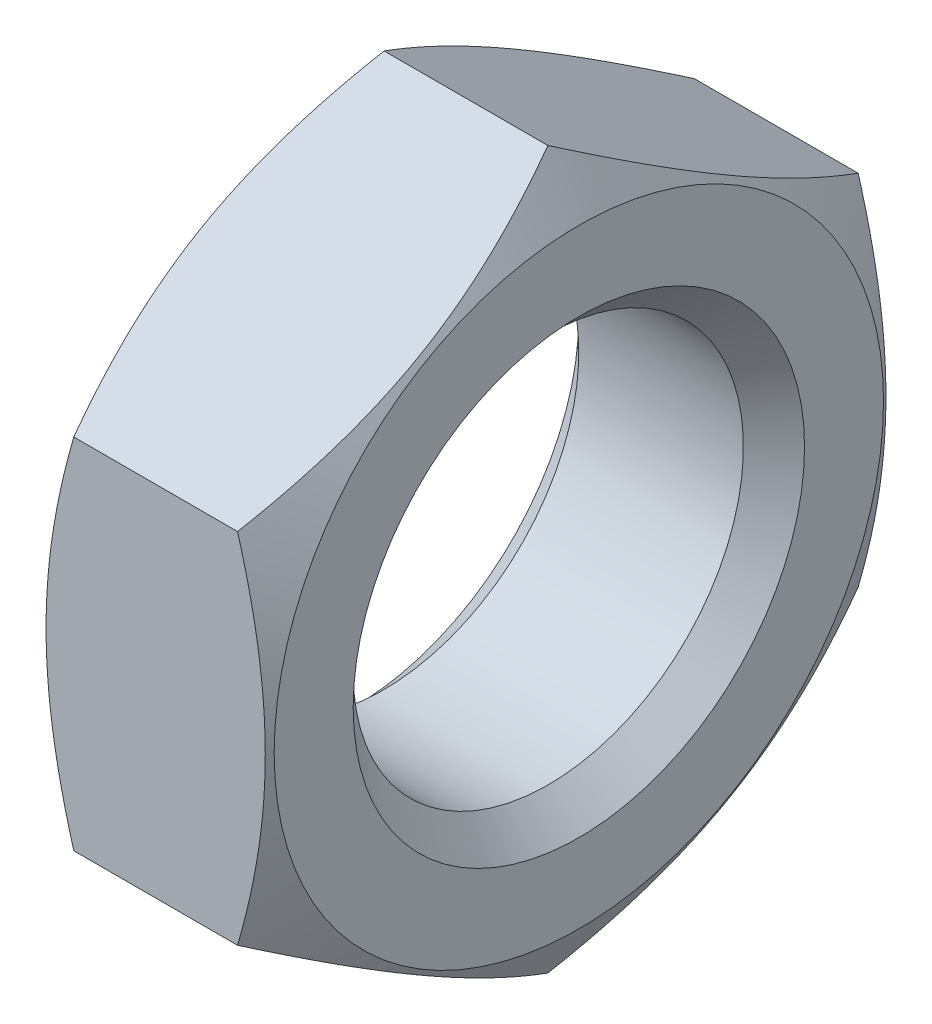
ISO-10303-21;
HEADER;
FILE_DESCRIPTION(('STEP AP214'),'2;1');
FILE_NAME('part.step','',(''),(''),'','','');
FILE_SCHEMA(('AUTOMOTIVE_DESIGN { 1 0 10303 214 1 1 1 1 }'));
ENDSEC;
DATA;
#1=APPLICATION_CONTEXT('core data for automotive mechanical design processes');
#2=APPLICATION_PROTOCOL_DEFINITION('international standard','automotive_design',2000,#1);
#3=PRODUCT_CONTEXT('',#1,'mechanical');
#4=PRODUCT('Part','Part','',(#3));
#5=PRODUCT_RELATED_PRODUCT_CATEGORY('part','',(#4));
#6=PRODUCT_DEFINITION_FORMATION('','',#4);
#7=PRODUCT_DEFINITION_CONTEXT('part definition',#1,'design');
#8=PRODUCT_DEFINITION('design','',#6,#7);
#9=PRODUCT_DEFINITION_SHAPE('','',#8);
#10=(LENGTH_UNIT() NAMED_UNIT(*) SI_UNIT(.MILLI.,.METRE.));
#11=(NAMED_UNIT(*) PLANE_ANGLE_UNIT() SI_UNIT($,.RADIAN.));
#12=(NAMED_UNIT(*) SI_UNIT($,.STERADIAN.) SOLID_ANGLE_UNIT());
#13=UNCERTAINTY_MEASURE_WITH_UNIT(LENGTH_MEASURE(1.E-05),#10,'distance_accuracy_value','');
#14=(GEOMETRIC_REPRESENTATION_CONTEXT(3) GLOBAL_UNCERTAINTY_ASSIGNED_CONTEXT((#13)) GLOBAL_UNIT_ASSIGNED_CONTEXT((#10,
#11,#12)) REPRESENTATION_CONTEXT('',''));
#15=CARTESIAN_POINT('',(0.,0.,0.));
#16=DIRECTION('',(0.,0.,1.));
#17=DIRECTION('',(1.,0.,0.));
#18=AXIS2_PLACEMENT_3D('',#15,#16,#17);
#19=CARTESIAN_POINT('',(2.,0.,0.));
#20=DIRECTION('',(1.,0.,0.));
#21=DIRECTION('',(0.,0.,-1.));
#22=AXIS2_PLACEMENT_3D('',#19,#20,#21);
#23=PLANE('',#22);
#24=CARTESIAN_POINT('',(2.,0.,0.));
#25=DIRECTION('',(-1.,0.,0.));
#26=DIRECTION('',(0.,0.,1.));
#27=AXIS2_PLACEMENT_3D('',#24,#25,#26);
#28=CIRCLE('',#27,4.);
#29=CARTESIAN_POINT('',(2.,0.,4.));
#30=VERTEX_POINT('',#29);
#31=EDGE_CURVE('E209',#30,#30,#28,.T.);
#32=ORIENTED_EDGE('',*,*,#31,.T.);
#33=EDGE_LOOP('',(#32));
#34=FACE_BOUND('',#33,.T.);
#35=CARTESIAN_POINT('',(2.,0.,0.));
#36=DIRECTION('',(-1.,0.,0.));
#37=DIRECTION('',(0.,0.,1.));
#38=AXIS2_PLACEMENT_3D('',#35,#36,#37);
#39=CIRCLE('',#38,5.4);
#40=CARTESIAN_POINT('',(2.,0.,5.4));
#41=VERTEX_POINT('',#40);
#42=EDGE_CURVE('E229',#41,#41,#39,.T.);
#43=ORIENTED_EDGE('',*,*,#42,.F.);
#44=EDGE_LOOP('',(#43));
#45=FACE_BOUND('',#44,.T.);
#46=ADVANCED_FACE('F37',(#34,#45),#23,.T.);
#47=CARTESIAN_POINT('',(-2.,0.,0.));
#48=DIRECTION('',(1.,0.,0.));
#49=DIRECTION('',(0.,0.,-1.));
#50=AXIS2_PLACEMENT_3D('',#47,#48,#49);
#51=PLANE('',#50);
#52=CARTESIAN_POINT('',(-2.,0.,0.));
#53=DIRECTION('',(-1.,0.,0.));
#54=DIRECTION('',(0.,0.,1.));
#55=AXIS2_PLACEMENT_3D('',#52,#53,#54);
#56=CIRCLE('',#55,4.);
#57=CARTESIAN_POINT('',(-2.,0.,4.));
#58=VERTEX_POINT('',#57);
#59=EDGE_CURVE('E114',#58,#58,#56,.T.);
#60=ORIENTED_EDGE('',*,*,#59,.F.);
#61=EDGE_LOOP('',(#60));
#62=FACE_BOUND('',#61,.T.);
#63=CARTESIAN_POINT('',(-2.,0.,0.));
#64=DIRECTION('',(-1.,0.,0.));
#65=DIRECTION('',(0.,0.,1.));
#66=AXIS2_PLACEMENT_3D('',#63,#64,#65);
#67=CIRCLE('',#66,5.4);
#68=CARTESIAN_POINT('',(-2.,0.,5.4));
#69=VERTEX_POINT('',#68);
#70=EDGE_CURVE('E97',#69,#69,#67,.T.);
#71=ORIENTED_EDGE('',*,*,#70,.T.);
#72=EDGE_LOOP('',(#71));
#73=FACE_BOUND('',#72,.T.);
#74=ADVANCED_FACE('F223',(#62,#73),#51,.F.);
#75=CARTESIAN_POINT('',(-1.4585,0.,0.));
#76=DIRECTION('',(-1.,0.,0.));
#77=DIRECTION('',(0.,0.,1.));
#78=AXIS2_PLACEMENT_3D('',#75,#76,#77);
#79=CONICAL_SURFACE('',#78,3.4585,0.785398163397448);
#80=ORIENTED_EDGE('',*,*,#59,.T.);
#81=EDGE_LOOP('',(#80));
#82=FACE_BOUND('',#81,.T.);
#83=CARTESIAN_POINT('',(-1.4585,0.,0.));
#84=DIRECTION('',(-1.,0.,0.));
#85=DIRECTION('',(0.,0.,1.));
#86=AXIS2_PLACEMENT_3D('',#83,#84,#85);
#87=CIRCLE('',#86,3.4585);
#88=CARTESIAN_POINT('',(-1.4585,0.,3.4585));
#89=VERTEX_POINT('',#88);
#90=EDGE_CURVE('E215',#89,#89,#87,.T.);
#91=ORIENTED_EDGE('',*,*,#90,.F.);
#92=EDGE_LOOP('',(#91));
#93=FACE_BOUND('',#92,.T.);
#94=ADVANCED_FACE('F220',(#82,#93),#79,.F.);
#95=CARTESIAN_POINT('',(2.,0.,0.));
#96=DIRECTION('',(-1.,0.,0.));
#97=DIRECTION('',(0.,0.,1.));
#98=AXIS2_PLACEMENT_3D('',#95,#96,#97);
#99=CYLINDRICAL_SURFACE('',#98,3.4585);
#100=ORIENTED_EDGE('',*,*,#90,.T.);
#101=EDGE_LOOP('',(#100));
#102=FACE_BOUND('',#101,.T.);
#103=CARTESIAN_POINT('',(1.4585,0.,0.));
#104=DIRECTION('',(-1.,0.,0.));
#105=DIRECTION('',(0.,0.,1.));
#106=AXIS2_PLACEMENT_3D('',#103,#104,#105);
#107=CIRCLE('',#106,3.4585);
#108=CARTESIAN_POINT('',(1.4585,0.,3.4585));
#109=VERTEX_POINT('',#108);
#110=EDGE_CURVE('E212',#109,#109,#107,.T.);
#111=ORIENTED_EDGE('',*,*,#110,.F.);
#112=EDGE_LOOP('',(#111));
#113=FACE_BOUND('',#112,.T.);
#114=ADVANCED_FACE('F287',(#102,#113),#99,.F.);
#115=CARTESIAN_POINT('',(2.,0.,0.));
#116=DIRECTION('',(1.,0.,0.));
#117=DIRECTION('',(0.,0.,-1.));
#118=AXIS2_PLACEMENT_3D('',#115,#116,#117);
#119=CONICAL_SURFACE('',#118,4.,0.785398163397448);
#120=ORIENTED_EDGE('',*,*,#110,.T.);
#121=EDGE_LOOP('',(#120));
#122=FACE_BOUND('',#121,.T.);
#123=ORIENTED_EDGE('',*,*,#31,.F.);
#124=EDGE_LOOP('',(#123));
#125=FACE_BOUND('',#124,.T.);
#126=ADVANCED_FACE('F157',(#122,#125),#119,.F.);
#127=CARTESIAN_POINT('',(-2.,0.,0.));
#128=DIRECTION('',(1.,0.,0.));
#129=DIRECTION('',(0.,0.,-1.));
#130=AXIS2_PLACEMENT_3D('',#127,#128,#129);
#131=CONICAL_SURFACE('',#130,5.4,1.0471975511966);
#132=ORIENTED_EDGE('',*,*,#70,.F.);
#133=EDGE_LOOP('',(#132));
#134=FACE_BOUND('',#133,.T.);
#135=CARTESIAN_POINT('',(0.784113443749843,-8.61649018684511,5.5));
#136=CARTESIAN_POINT('',(0.666878812783997,-8.37552882727682,5.5));
#137=CARTESIAN_POINT('',(0.550743390874346,-8.13402357629088,5.5));
#138=CARTESIAN_POINT('',(0.321287470280928,-7.64963639126843,5.5));
#139=CARTESIAN_POINT('',(0.207967398695277,-7.40675425513533,5.5));
#140=CARTESIAN_POINT('',(-0.0157929884205948,-6.91811415046306,5.5));
#141=CARTESIAN_POINT('',(-0.126215004170548,-6.67234777367908,5.5));
#142=CARTESIAN_POINT('',(-0.342654969596933,-6.17889047949948,5.5));
#143=CARTESIAN_POINT('',(-0.448673121640389,-5.93119965115882,5.5));
#144=CARTESIAN_POINT('',(-0.658600467087506,-5.42517186891712,5.5));
#145=CARTESIAN_POINT('',(-0.762320422184984,-5.16675598886647,5.5));
#146=CARTESIAN_POINT('',(-0.962118747037396,-4.6469329169376,5.5));
#147=CARTESIAN_POINT('',(-1.05819627140808,-4.38552539778091,5.5));
#148=CARTESIAN_POINT('',(-1.24025124215414,-3.85976601496737,5.5));
#149=CARTESIAN_POINT('',(-1.3262484073163,-3.59542104580034,5.5));
#150=CARTESIAN_POINT('',(-1.48543975232521,-3.06293694594078,5.5));
#151=CARTESIAN_POINT('',(-1.55863787395657,-2.79479901098241,5.5));
#152=CARTESIAN_POINT('',(-1.6883840040391,-2.25609913996338,5.5));
#153=CARTESIAN_POINT('',(-1.74502563454898,-1.9855601132483,5.5));
#154=CARTESIAN_POINT('',(-1.83850933501161,-1.44098961438313,5.5));
#155=CARTESIAN_POINT('',(-1.87535342543688,-1.16695850154727,5.5));
#156=CARTESIAN_POINT('',(-1.91332936173482,-0.756204569653661,5.5));
#157=CARTESIAN_POINT('',(-1.92309725948238,-0.620247319437219,5.5));
#158=CARTESIAN_POINT('',(-1.9368747665775,-0.348045878571672,5.5));
#159=CARTESIAN_POINT('',(-1.94088491768322,-0.211801716126978,5.5));
#160=CARTESIAN_POINT('',(-1.94304622483372,0.06074358164608,5.5));
#161=CARTESIAN_POINT('',(-1.94119691038516,0.197044720670794,5.5));
#162=CARTESIAN_POINT('',(-1.93168662957024,0.469434533184992,5.5));
#163=CARTESIAN_POINT('',(-1.92402588138275,0.605523214458589,5.5));
#164=CARTESIAN_POINT('',(-1.89899644697809,0.929994242672534,5.5));
#165=CARTESIAN_POINT('',(-1.87901437870704,1.11817945565695,5.5));
#166=CARTESIAN_POINT('',(-1.82900797286511,1.49320092322069,5.5));
#167=CARTESIAN_POINT('',(-1.79898234204711,1.68003700091358,5.5));
#168=CARTESIAN_POINT('',(-1.69542809214979,2.23828118446945,5.5));
#169=CARTESIAN_POINT('',(-1.60843937722605,2.60722815877613,5.5));
#170=CARTESIAN_POINT('',(-1.45698147742335,3.15902046903996,5.5));
#171=CARTESIAN_POINT('',(-1.40227782374634,3.34471145261655,5.5));
#172=CARTESIAN_POINT('',(-1.28703497257315,3.714291476791,5.5));
#173=CARTESIAN_POINT('',(-1.22649573471635,3.89818050491632,5.5));
#174=CARTESIAN_POINT('',(-1.10056574792467,4.26421150500201,5.5));
#175=CARTESIAN_POINT('',(-1.03517648373062,4.446353992507,5.5));
#176=CARTESIAN_POINT('',(-0.90033110397769,4.80911957514401,5.5));
#177=CARTESIAN_POINT('',(-0.830875048241357,4.9897426925813,5.5));
#178=CARTESIAN_POINT('',(-0.655718433206676,5.432716506941,5.5));
#179=CARTESIAN_POINT('',(-0.548087902925681,5.69430288472036,5.5));
#180=CARTESIAN_POINT('',(-0.327205022834359,6.21509900538682,5.5));
#181=CARTESIAN_POINT('',(-0.213952250737957,6.47430856801397,5.5));
#182=CARTESIAN_POINT('',(0.0169882335780446,6.99081532432005,5.5));
#183=CARTESIAN_POINT('',(0.134677031739859,7.24811203103113,5.5));
#184=CARTESIAN_POINT('',(0.373555198105092,7.76107844152761,5.5));
#185=CARTESIAN_POINT('',(0.494744652441861,8.01674810509055,5.5));
#186=CARTESIAN_POINT('',(0.740083399738742,8.52704887122562,5.5));
#187=CARTESIAN_POINT('',(0.864236156536966,8.78167830543824,5.5));
#188=CARTESIAN_POINT('',(1.11483419370451,9.28980766382626,5.5));
#189=CARTESIAN_POINT('',(1.24127949642127,9.5433075769612,5.5));
#190=CARTESIAN_POINT('',(1.62337644927655,10.3023145200846,5.5));
#191=CARTESIAN_POINT('',(1.88182910949109,10.8064111488454,5.5));
#192=CARTESIAN_POINT('',(2.3803301306435,11.7665070805488,5.5));
#193=CARTESIAN_POINT('',(2.61993279563596,12.222738882869,5.5));
#194=CARTESIAN_POINT('',(3.10234058749318,13.1335302206051,5.5));
#195=CARTESIAN_POINT('',(3.34514585172205,13.5880896832154,5.5));
#196=CARTESIAN_POINT('',(3.83248871005734,14.4946368928826,5.5));
#197=CARTESIAN_POINT('',(4.07701954950786,14.9466282770015,5.5));
#198=CARTESIAN_POINT('',(4.56796368692335,15.8495513113053,5.5));
#199=CARTESIAN_POINT('',(4.81437686600827,16.3004830261002,5.5));
#200=CARTESIAN_POINT('',(5.06148675954346,16.751030036576,5.5));
#201=B_SPLINE_CURVE_WITH_KNOTS('',3,(#135,#136,#137,#138,#139,#140,#141,#142,#143,#144,#145,
#146,#147,#148,#149,#150,#151,#152,#153,#154,#155,#156,#157,#158,#159,#160,#161,#162,#163,#164,
#165,#166,#167,#168,#169,#170,#171,#172,#173,#174,#175,#176,#177,#178,#179,#180,#181,#182,#183,
#184,#185,#186,#187,#188,#189,#190,#191,#192,#193,#194,#195,#196,#197,#198,#199,#200),
.UNSPECIFIED.,.F.,.F.,(4,2,2,2,2,2,2,2,2,2,2,2,2,2,2,2,2,2,2,2,2,2,2,2,2,2,2,2,2,2,2,2,4),(0.,
0.80391053793647,1.6079422961888,2.41620661179091,3.22443374472603,4.05970219374216,
4.89506290969333,5.72876124852091,6.56220237518367,7.39083518546822,8.21938341211543,
8.62820309904799,9.03698431677828,9.44579835895563,9.85459705377212,10.4220076622402,
10.9894913607876,12.125049587267,12.7057420601234,13.2864385495102,13.8669579979469,
14.4474689090817,15.2959680877209,16.1445310937663,16.9933031952078,17.8420961984341,
18.6919353169031,19.5417827239507,21.2412028410503,22.7871558297497,24.3331753436265,
25.874865733381,27.4164595489447),.UNSPECIFIED.);
#202=CARTESIAN_POINT('',(-1.45102478695733,-3.1754264805429,5.5));
#203=VERTEX_POINT('',#202);
#204=CARTESIAN_POINT('',(-1.45102478695733,3.1754264805429,5.5));
#205=VERTEX_POINT('',#204);
#206=EDGE_CURVE('E53',#203,#205,#201,.T.);
#207=ORIENTED_EDGE('',*,*,#206,.T.);
#208=CARTESIAN_POINT('',(-1.45095811847252,3.17531101048906,5.5002));
#209=CARTESIAN_POINT('',(-1.49125139790122,3.24511067806418,5.37930342940848));
#210=CARTESIAN_POINT('',(-1.52971605921933,3.3151705928067,5.25795609750049));
#211=CARTESIAN_POINT('',(-1.60248450149056,3.45585938651129,5.01427595874856));
#212=CARTESIAN_POINT('',(-1.63678648749366,3.52648849701128,4.89194275086919));
#213=CARTESIAN_POINT('',(-1.7327751540074,3.73950670736877,4.52298438759264));
#214=CARTESIAN_POINT('',(-1.78737266542132,3.88273666897656,4.2749028169218));
#215=CARTESIAN_POINT('',(-1.85139513517346,4.09707770471201,3.90365325288108));
#216=CARTESIAN_POINT('',(-1.86963337340979,4.16754833602165,3.78159453901133));
#217=CARTESIAN_POINT('',(-1.90021645806482,4.30880802924418,3.53692557328832));
#218=CARTESIAN_POINT('',(-1.91256182519871,4.37959706246375,3.41431537113335));
#219=CARTESIAN_POINT('',(-1.93104454206384,4.52129808426999,3.16888200188052));
#220=CARTESIAN_POINT('',(-1.93718893737989,4.59220984140338,3.0460592356715));
#221=CARTESIAN_POINT('',(-1.94314454882016,4.7340949578992,2.80030700506291));
#222=CARTESIAN_POINT('',(-1.94295596057464,4.80506831529103,2.67737754407652));
#223=CARTESIAN_POINT('',(-1.93373406113082,4.99951505180813,2.34058591706296));
#224=CARTESIAN_POINT('',(-1.9182510049378,5.12292478867203,2.12683398266599));
#225=CARTESIAN_POINT('',(-1.86915286895632,5.36892457999607,1.7007498454414));
#226=CARTESIAN_POINT('',(-1.83552100569145,5.49151376923311,1.48841914122418));
#227=CARTESIAN_POINT('',(-1.75145062288955,5.73800868579223,1.06147742193635));
#228=CARTESIAN_POINT('',(-1.70065588529232,5.86188330811686,0.84692028230169));
#229=CARTESIAN_POINT('',(-1.58537213921055,6.10778517066234,0.421005762697096));
#230=CARTESIAN_POINT('',(-1.52091021259377,6.22981556037921,0.209642927640055));
#231=CARTESIAN_POINT('',(-1.4509581184725,6.35096843113974,-0.000199999999999625));
#232=B_SPLINE_CURVE_WITH_KNOTS('',3,(#208,#209,#210,#211,#212,#213,#214,#215,#216,#217,#218,
#219,#220,#221,#222,#223,#224,#225,#226,#227,#228,#229,#230,#231),.UNSPECIFIED.,.F.,.F.,(4,2,2,
2,2,2,2,2,2,2,2,4),(0.,0.435859336764065,0.871905953714896,1.74581116421112,2.17206086600113,
2.59827289586658,3.02400011377214,3.44971418068092,4.19085033838045,4.93267305422207,
5.69094899585909,6.44773620806184),.UNSPECIFIED.);
#233=CARTESIAN_POINT('',(-1.45102478695731,6.3508529610859,0.));
#234=VERTEX_POINT('',#233);
#235=EDGE_CURVE('E88',#205,#234,#232,.T.);
#236=ORIENTED_EDGE('',*,*,#235,.T.);
#237=CARTESIAN_POINT('',(-1.4509581184725,6.35096843113974,0.0002));
#238=CARTESIAN_POINT('',(-1.4912513979012,6.28116876356462,-0.120696570591515));
#239=CARTESIAN_POINT('',(-1.52971605921931,6.2111088488221,-0.242043902499506));
#240=CARTESIAN_POINT('',(-1.60248450149054,6.0704200551175,-0.485724041251439));
#241=CARTESIAN_POINT('',(-1.63678648749364,5.99979094461752,-0.60805724913081));
#242=CARTESIAN_POINT('',(-1.73277515400738,5.78677273426003,-0.977015612407364));
#243=CARTESIAN_POINT('',(-1.7873726654213,5.64354277265223,-1.2250971830782));
#244=CARTESIAN_POINT('',(-1.85139513517345,5.42920173691679,-1.59634674711893));
#245=CARTESIAN_POINT('',(-1.86963337340978,5.35873110560715,-1.71840546098868));
#246=CARTESIAN_POINT('',(-1.90021645806482,5.21747141238461,-1.96307442671169));
#247=CARTESIAN_POINT('',(-1.9125618251987,5.14668237916505,-2.08568462886666));
#248=CARTESIAN_POINT('',(-1.93104454206384,5.0049813573588,-2.3311179981195));
#249=CARTESIAN_POINT('',(-1.93718893737989,4.93406960022541,-2.45394076432851));
#250=CARTESIAN_POINT('',(-1.94314454882016,4.79218448372959,-2.6996929949371));
#251=CARTESIAN_POINT('',(-1.94295596057464,4.72121112633776,-2.82262245592349));
#252=CARTESIAN_POINT('',(-1.93373406113082,4.52676438982067,-3.15941408293705));
#253=CARTESIAN_POINT('',(-1.91825100493781,4.40335465295677,-3.37316601733403));
#254=CARTESIAN_POINT('',(-1.86915286895633,4.15735486163272,-3.79925015455861));
#255=CARTESIAN_POINT('',(-1.83552100569146,4.03476567239569,-4.01158085877582));
#256=CARTESIAN_POINT('',(-1.75145062288956,3.78827075583657,-4.43852257806365));
#257=CARTESIAN_POINT('',(-1.70065588529233,3.66439613351194,-4.65307971769831));
#258=CARTESIAN_POINT('',(-1.58537213921056,3.41849427096646,-5.07899423730291));
#259=CARTESIAN_POINT('',(-1.52091021259379,3.29646388124959,-5.29035707235995));
#260=CARTESIAN_POINT('',(-1.45095811847252,3.17531101048906,-5.5002));
#261=B_SPLINE_CURVE_WITH_KNOTS('',3,(#237,#238,#239,#240,#241,#242,#243,#244,#245,#246,#247,
#248,#249,#250,#251,#252,#253,#254,#255,#256,#257,#258,#259,#260),.UNSPECIFIED.,.F.,.F.,(4,2,2,
2,2,2,2,2,2,2,2,4),(0.,0.435859336764067,0.8719059537149,1.74581116421113,2.17206086600114,
2.59827289586659,3.02400011377216,3.44971418068095,4.19085033838047,4.93267305422208,
5.6909489958591,6.44773620806184),.UNSPECIFIED.);
#262=CARTESIAN_POINT('',(-1.45102478695733,3.1754264805429,-5.5));
#263=VERTEX_POINT('',#262);
#264=EDGE_CURVE('E91',#234,#263,#261,.T.);
#265=ORIENTED_EDGE('',*,*,#264,.T.);
#266=CARTESIAN_POINT('',(0.784113443749843,-8.61649018684511,-5.5));
#267=CARTESIAN_POINT('',(0.666878812783997,-8.37552882727682,-5.5));
#268=CARTESIAN_POINT('',(0.550743390874346,-8.13402357629088,-5.5));
#269=CARTESIAN_POINT('',(0.321287470280928,-7.64963639126843,-5.5));
#270=CARTESIAN_POINT('',(0.207967398695277,-7.40675425513533,-5.5));
#271=CARTESIAN_POINT('',(-0.0157929884205948,-6.91811415046306,-5.5));
#272=CARTESIAN_POINT('',(-0.126215004170548,-6.67234777367908,-5.5));
#273=CARTESIAN_POINT('',(-0.342654969596933,-6.17889047949948,-5.5));
#274=CARTESIAN_POINT('',(-0.448673121640389,-5.93119965115882,-5.5));
#275=CARTESIAN_POINT('',(-0.658600467087506,-5.42517186891712,-5.5));
#276=CARTESIAN_POINT('',(-0.762320422184984,-5.16675598886647,-5.5));
#277=CARTESIAN_POINT('',(-0.962118747037396,-4.6469329169376,-5.5));
#278=CARTESIAN_POINT('',(-1.05819627140808,-4.38552539778091,-5.5));
#279=CARTESIAN_POINT('',(-1.24025124215414,-3.85976601496737,-5.5));
#280=CARTESIAN_POINT('',(-1.3262484073163,-3.59542104580034,-5.5));
#281=CARTESIAN_POINT('',(-1.48543975232521,-3.06293694594078,-5.5));
#282=CARTESIAN_POINT('',(-1.55863787395657,-2.79479901098241,-5.5));
#283=CARTESIAN_POINT('',(-1.6883840040391,-2.25609913996338,-5.5));
#284=CARTESIAN_POINT('',(-1.74502563454898,-1.9855601132483,-5.5));
#285=CARTESIAN_POINT('',(-1.83850933501161,-1.44098961438313,-5.5));
#286=CARTESIAN_POINT('',(-1.87535342543688,-1.16695850154727,-5.5));
#287=CARTESIAN_POINT('',(-1.91332936173482,-0.756204569653661,-5.5));
#288=CARTESIAN_POINT('',(-1.92309725948238,-0.620247319437219,-5.5));
#289=CARTESIAN_POINT('',(-1.9368747665775,-0.348045878571672,-5.5));
#290=CARTESIAN_POINT('',(-1.94088491768322,-0.211801716126978,-5.5));
#291=CARTESIAN_POINT('',(-1.94304622483372,0.06074358164608,-5.5));
#292=CARTESIAN_POINT('',(-1.94119691038516,0.197044720670794,-5.5));
#293=CARTESIAN_POINT('',(-1.93168662957024,0.469434533184992,-5.5));
#294=CARTESIAN_POINT('',(-1.92402588138275,0.605523214458589,-5.5));
#295=CARTESIAN_POINT('',(-1.89899644697809,0.929994242672534,-5.5));
#296=CARTESIAN_POINT('',(-1.87901437870704,1.11817945565695,-5.5));
#297=CARTESIAN_POINT('',(-1.82900797286511,1.49320092322069,-5.5));
#298=CARTESIAN_POINT('',(-1.79898234204711,1.68003700091358,-5.5));
#299=CARTESIAN_POINT('',(-1.69542809214979,2.23828118446945,-5.5));
#300=CARTESIAN_POINT('',(-1.60843937722605,2.60722815877613,-5.5));
#301=CARTESIAN_POINT('',(-1.45698147742335,3.15902046903996,-5.5));
#302=CARTESIAN_POINT('',(-1.40227782374634,3.34471145261655,-5.5));
#303=CARTESIAN_POINT('',(-1.28703497257315,3.714291476791,-5.5));
#304=CARTESIAN_POINT('',(-1.22649573471635,3.89818050491632,-5.5));
#305=CARTESIAN_POINT('',(-1.10056574792467,4.26421150500201,-5.5));
#306=CARTESIAN_POINT('',(-1.03517648373062,4.446353992507,-5.5));
#307=CARTESIAN_POINT('',(-0.90033110397769,4.80911957514401,-5.5));
#308=CARTESIAN_POINT('',(-0.830875048241357,4.9897426925813,-5.5));
#309=CARTESIAN_POINT('',(-0.655718433206676,5.432716506941,-5.5));
#310=CARTESIAN_POINT('',(-0.548087902925681,5.69430288472036,-5.5));
#311=CARTESIAN_POINT('',(-0.327205022834359,6.21509900538682,-5.5));
#312=CARTESIAN_POINT('',(-0.213952250737957,6.47430856801397,-5.5));
#313=CARTESIAN_POINT('',(0.0169882335780446,6.99081532432005,-5.5));
#314=CARTESIAN_POINT('',(0.134677031739859,7.24811203103113,-5.5));
#315=CARTESIAN_POINT('',(0.373555198105092,7.76107844152761,-5.5));
#316=CARTESIAN_POINT('',(0.494744652441861,8.01674810509055,-5.5));
#317=CARTESIAN_POINT('',(0.740083399738742,8.52704887122562,-5.5));
#318=CARTESIAN_POINT('',(0.864236156536966,8.78167830543824,-5.5));
#319=CARTESIAN_POINT('',(1.11483419370451,9.28980766382626,-5.5));
#320=CARTESIAN_POINT('',(1.24127949642127,9.5433075769612,-5.5));
#321=CARTESIAN_POINT('',(1.62337644927655,10.3023145200846,-5.5));
#322=CARTESIAN_POINT('',(1.88182910949109,10.8064111488454,-5.5));
#323=CARTESIAN_POINT('',(2.3803301306435,11.7665070805488,-5.5));
#324=CARTESIAN_POINT('',(2.61993279563596,12.222738882869,-5.5));
#325=CARTESIAN_POINT('',(3.10234058749318,13.1335302206051,-5.5));
#326=CARTESIAN_POINT('',(3.34514585172205,13.5880896832154,-5.5));
#327=CARTESIAN_POINT('',(3.83248871005734,14.4946368928826,-5.5));
#328=CARTESIAN_POINT('',(4.07701954950786,14.9466282770015,-5.5));
#329=CARTESIAN_POINT('',(4.56796368692335,15.8495513113053,-5.5));
#330=CARTESIAN_POINT('',(4.81437686600827,16.3004830261002,-5.5));
#331=CARTESIAN_POINT('',(5.06148675954346,16.751030036576,-5.5));
#332=B_SPLINE_CURVE_WITH_KNOTS('',3,(#266,#267,#268,#269,#270,#271,#272,#273,#274,#275,#276,
#277,#278,#279,#280,#281,#282,#283,#284,#285,#286,#287,#288,#289,#290,#291,#292,#293,#294,#295,
#296,#297,#298,#299,#300,#301,#302,#303,#304,#305,#306,#307,#308,#309,#310,#311,#312,#313,#314,
#315,#316,#317,#318,#319,#320,#321,#322,#323,#324,#325,#326,#327,#328,#329,#330,#331),
.UNSPECIFIED.,.F.,.F.,(4,2,2,2,2,2,2,2,2,2,2,2,2,2,2,2,2,2,2,2,2,2,2,2,2,2,2,2,2,2,2,2,4),(0.,
0.80391053793647,1.6079422961888,2.41620661179091,3.22443374472603,4.05970219374216,
4.89506290969333,5.72876124852091,6.56220237518367,7.39083518546822,8.21938341211543,
8.62820309904799,9.03698431677828,9.44579835895563,9.85459705377212,10.4220076622402,
10.9894913607876,12.125049587267,12.7057420601234,13.2864385495102,13.8669579979469,
14.4474689090817,15.2959680877209,16.1445310937663,16.9933031952078,17.8420961984341,
18.6919353169031,19.5417827239507,21.2412028410503,22.7871558297497,24.3331753436265,
25.874865733381,27.4164595489447),.UNSPECIFIED.);
#333=CARTESIAN_POINT('',(-1.45102478695759,-3.17542648054329,-5.5));
#334=VERTEX_POINT('',#333);
#335=EDGE_CURVE('E106',#263,#334,#332,.F.);
#336=ORIENTED_EDGE('',*,*,#335,.T.);
#337=CARTESIAN_POINT('',(-1.45095811847252,-3.17531101048906,-5.5002));
#338=CARTESIAN_POINT('',(-1.49125139790122,-3.24511067806418,-5.37930342940848));
#339=CARTESIAN_POINT('',(-1.52971605921933,-3.3151705928067,-5.25795609750049));
#340=CARTESIAN_POINT('',(-1.60248450149056,-3.45585938651129,-5.01427595874856));
#341=CARTESIAN_POINT('',(-1.63678648749366,-3.52648849701128,-4.89194275086919));
#342=CARTESIAN_POINT('',(-1.7327751540074,-3.73950670736877,-4.52298438759264));
#343=CARTESIAN_POINT('',(-1.78737266542132,-3.88273666897656,-4.2749028169218));
#344=CARTESIAN_POINT('',(-1.85139513517346,-4.09707770471201,-3.90365325288108));
#345=CARTESIAN_POINT('',(-1.86963337340979,-4.16754833602165,-3.78159453901133));
#346=CARTESIAN_POINT('',(-1.90021645806482,-4.30880802924418,-3.53692557328832));
#347=CARTESIAN_POINT('',(-1.91256182519871,-4.37959706246375,-3.41431537113335));
#348=CARTESIAN_POINT('',(-1.93104454206384,-4.52129808426999,-3.16888200188052));
#349=CARTESIAN_POINT('',(-1.93718893737989,-4.59220984140338,-3.0460592356715));
#350=CARTESIAN_POINT('',(-1.94314454882016,-4.7340949578992,-2.80030700506291));
#351=CARTESIAN_POINT('',(-1.94295596057464,-4.80506831529103,-2.67737754407652));
#352=CARTESIAN_POINT('',(-1.93373406113082,-4.99951505180813,-2.34058591706296));
#353=CARTESIAN_POINT('',(-1.9182510049378,-5.12292478867203,-2.12683398266599));
#354=CARTESIAN_POINT('',(-1.86915286895632,-5.36892457999607,-1.7007498454414));
#355=CARTESIAN_POINT('',(-1.83552100569145,-5.49151376923311,-1.48841914122418));
#356=CARTESIAN_POINT('',(-1.75145062288955,-5.73800868579223,-1.06147742193635));
#357=CARTESIAN_POINT('',(-1.70065588529232,-5.86188330811686,-0.84692028230169));
#358=CARTESIAN_POINT('',(-1.58537213921055,-6.10778517066234,-0.421005762697096));
#359=CARTESIAN_POINT('',(-1.52091021259377,-6.22981556037921,-0.209642927640055));
#360=CARTESIAN_POINT('',(-1.4509581184725,-6.35096843113974,0.000199999999999625));
#361=B_SPLINE_CURVE_WITH_KNOTS('',3,(#337,#338,#339,#340,#341,#342,#343,#344,#345,#346,#347,
#348,#349,#350,#351,#352,#353,#354,#355,#356,#357,#358,#359,#360),.UNSPECIFIED.,.F.,.F.,(4,2,2,
2,2,2,2,2,2,2,2,4),(0.,0.435859336764065,0.871905953714896,1.74581116421112,2.17206086600113,
2.59827289586658,3.02400011377214,3.44971418068092,4.19085033838045,4.93267305422207,
5.69094899585909,6.44773620806184),.UNSPECIFIED.);
#362=CARTESIAN_POINT('',(-1.45102478695731,-6.3508529610859,0.));
#363=VERTEX_POINT('',#362);
#364=EDGE_CURVE('E126',#334,#363,#361,.T.);
#365=ORIENTED_EDGE('',*,*,#364,.T.);
#366=CARTESIAN_POINT('',(-1.4509581184725,-6.35096843113974,-0.0002));
#367=CARTESIAN_POINT('',(-1.4912513979012,-6.28116876356462,0.120696570591515));
#368=CARTESIAN_POINT('',(-1.52971605921931,-6.2111088488221,0.242043902499506));
#369=CARTESIAN_POINT('',(-1.60248450149054,-6.0704200551175,0.485724041251439));
#370=CARTESIAN_POINT('',(-1.63678648749364,-5.99979094461752,0.60805724913081));
#371=CARTESIAN_POINT('',(-1.73277515400738,-5.78677273426003,0.977015612407364));
#372=CARTESIAN_POINT('',(-1.7873726654213,-5.64354277265223,1.2250971830782));
#373=CARTESIAN_POINT('',(-1.85139513517345,-5.42920173691679,1.59634674711893));
#374=CARTESIAN_POINT('',(-1.86963337340978,-5.35873110560715,1.71840546098868));
#375=CARTESIAN_POINT('',(-1.90021645806482,-5.21747141238461,1.96307442671169));
#376=CARTESIAN_POINT('',(-1.9125618251987,-5.14668237916505,2.08568462886666));
#377=CARTESIAN_POINT('',(-1.93104454206384,-5.0049813573588,2.3311179981195));
#378=CARTESIAN_POINT('',(-1.93718893737989,-4.93406960022541,2.45394076432851));
#379=CARTESIAN_POINT('',(-1.94314454882016,-4.79218448372959,2.6996929949371));
#380=CARTESIAN_POINT('',(-1.94295596057464,-4.72121112633776,2.82262245592349));
#381=CARTESIAN_POINT('',(-1.93373406113082,-4.52676438982067,3.15941408293705));
#382=CARTESIAN_POINT('',(-1.91825100493781,-4.40335465295677,3.37316601733403));
#383=CARTESIAN_POINT('',(-1.86915286895633,-4.15735486163272,3.79925015455861));
#384=CARTESIAN_POINT('',(-1.83552100569146,-4.03476567239569,4.01158085877582));
#385=CARTESIAN_POINT('',(-1.75145062288956,-3.78827075583657,4.43852257806365));
#386=CARTESIAN_POINT('',(-1.70065588529233,-3.66439613351194,4.65307971769831));
#387=CARTESIAN_POINT('',(-1.58537213921056,-3.41849427096646,5.07899423730291));
#388=CARTESIAN_POINT('',(-1.52091021259379,-3.29646388124959,5.29035707235995));
#389=CARTESIAN_POINT('',(-1.45095811847252,-3.17531101048906,5.5002));
#390=B_SPLINE_CURVE_WITH_KNOTS('',3,(#366,#367,#368,#369,#370,#371,#372,#373,#374,#375,#376,
#377,#378,#379,#380,#381,#382,#383,#384,#385,#386,#387,#388,#389),.UNSPECIFIED.,.F.,.F.,(4,2,2,
2,2,2,2,2,2,2,2,4),(0.,0.435859336764067,0.8719059537149,1.74581116421113,2.17206086600114,
2.59827289586659,3.02400011377216,3.44971418068095,4.19085033838047,4.93267305422208,
5.6909489958591,6.44773620806184),.UNSPECIFIED.);
#391=EDGE_CURVE('E134',#363,#203,#390,.T.);
#392=ORIENTED_EDGE('',*,*,#391,.T.);
#393=EDGE_LOOP('',(#207,#236,#265,#336,#365,#392));
#394=FACE_BOUND('',#393,.T.);
#395=ADVANCED_FACE('F90',(#134,#394),#131,.T.);
#396=CARTESIAN_POINT('',(0.,0.,0.));
#397=DIRECTION('',(-1.,0.,0.));
#398=DIRECTION('',(0.,0.,1.));
#399=AXIS2_PLACEMENT_3D('',#396,#397,#398);
#400=CONICAL_SURFACE('',#399,8.8641016151378,1.0471975511966);
#401=ORIENTED_EDGE('',*,*,#42,.T.);
#402=EDGE_LOOP('',(#401));
#403=FACE_BOUND('',#402,.T.);
#404=CARTESIAN_POINT('',(-0.784113443749844,-8.61649018684511,5.5));
#405=CARTESIAN_POINT('',(-0.666878812783998,-8.37552882727682,5.5));
#406=CARTESIAN_POINT('',(-0.550743390874347,-8.13402357629088,5.5));
#407=CARTESIAN_POINT('',(-0.321287470280928,-7.64963639126843,5.5));
#408=CARTESIAN_POINT('',(-0.207967398695277,-7.40675425513533,5.5));
#409=CARTESIAN_POINT('',(0.0157929884205948,-6.91811415046306,5.5));
#410=CARTESIAN_POINT('',(0.126215004170548,-6.67234777367908,5.5));
#411=CARTESIAN_POINT('',(0.342654969596934,-6.17889047949948,5.5));
#412=CARTESIAN_POINT('',(0.448673121640389,-5.93119965115882,5.5));
#413=CARTESIAN_POINT('',(0.658600467087507,-5.42517186891711,5.5));
#414=CARTESIAN_POINT('',(0.762320422184984,-5.16675598886647,5.5));
#415=CARTESIAN_POINT('',(0.962118747037396,-4.64693291693759,5.5));
#416=CARTESIAN_POINT('',(1.05819627140808,-4.38552539778091,5.5));
#417=CARTESIAN_POINT('',(1.24025124215414,-3.85976601496737,5.5));
#418=CARTESIAN_POINT('',(1.3262484073163,-3.59542104580034,5.5));
#419=CARTESIAN_POINT('',(1.48543975232521,-3.06293694594078,5.5));
#420=CARTESIAN_POINT('',(1.55863787395657,-2.79479901098241,5.5));
#421=CARTESIAN_POINT('',(1.6883840040391,-2.25609913996338,5.5));
#422=CARTESIAN_POINT('',(1.74502563454898,-1.9855601132483,5.5));
#423=CARTESIAN_POINT('',(1.83850933501161,-1.44098961438313,5.5));
#424=CARTESIAN_POINT('',(1.87535342543688,-1.16695850154727,5.5));
#425=CARTESIAN_POINT('',(1.91332936173482,-0.756204569653661,5.5));
#426=CARTESIAN_POINT('',(1.92309725948238,-0.620247319437221,5.5));
#427=CARTESIAN_POINT('',(1.9368747665775,-0.348045878571674,5.5));
#428=CARTESIAN_POINT('',(1.94088491768322,-0.21180171612698,5.5));
#429=CARTESIAN_POINT('',(1.94304622483372,0.0607435816460788,5.5));
#430=CARTESIAN_POINT('',(1.94119691038516,0.197044720670792,5.5));
#431=CARTESIAN_POINT('',(1.93168662957024,0.469434533184991,5.5));
#432=CARTESIAN_POINT('',(1.92402588138275,0.605523214458589,5.5));
#433=CARTESIAN_POINT('',(1.89899644697809,0.929994242672534,5.5));
#434=CARTESIAN_POINT('',(1.87901437870704,1.11817945565696,5.5));
#435=CARTESIAN_POINT('',(1.82900797286511,1.49320092322069,5.5));
#436=CARTESIAN_POINT('',(1.79898234204711,1.68003700091358,5.5));
#437=CARTESIAN_POINT('',(1.69542809214979,2.23828118446945,5.5));
#438=CARTESIAN_POINT('',(1.60843937722605,2.60722815877613,5.5));
#439=CARTESIAN_POINT('',(1.45698147742335,3.15902046903997,5.5));
#440=CARTESIAN_POINT('',(1.40227782374634,3.34471145261655,5.5));
#441=CARTESIAN_POINT('',(1.28703497257315,3.714291476791,5.5));
#442=CARTESIAN_POINT('',(1.22649573471635,3.89818050491632,5.5));
#443=CARTESIAN_POINT('',(1.10056574792467,4.26421150500201,5.5));
#444=CARTESIAN_POINT('',(1.03517648373062,4.446353992507,5.5));
#445=CARTESIAN_POINT('',(0.900331103977689,4.80911957514401,5.5));
#446=CARTESIAN_POINT('',(0.830875048241357,4.9897426925813,5.5));
#447=CARTESIAN_POINT('',(0.655718433206676,5.432716506941,5.5));
#448=CARTESIAN_POINT('',(0.548087902925681,5.69430288472036,5.5));
#449=CARTESIAN_POINT('',(0.327205022834359,6.21509900538681,5.5));
#450=CARTESIAN_POINT('',(0.213952250737958,6.47430856801396,5.5));
#451=CARTESIAN_POINT('',(-0.016988233578043,6.99081532432005,5.5));
#452=CARTESIAN_POINT('',(-0.134677031739857,7.24811203103113,5.5));
#453=CARTESIAN_POINT('',(-0.373555198105089,7.76107844152761,5.5));
#454=CARTESIAN_POINT('',(-0.494744652441857,8.01674810509054,5.5));
#455=CARTESIAN_POINT('',(-0.740083399738738,8.52704887122561,5.5));
#456=CARTESIAN_POINT('',(-0.864236156536963,8.78167830543823,5.5));
#457=CARTESIAN_POINT('',(-1.11483419370451,9.28980766382626,5.5));
#458=CARTESIAN_POINT('',(-1.24127949642126,9.54330757696119,5.5));
#459=CARTESIAN_POINT('',(-1.62337644927655,10.3023145200846,5.5));
#460=CARTESIAN_POINT('',(-1.88182910949108,10.8064111488454,5.5));
#461=CARTESIAN_POINT('',(-2.3803301306435,11.7665070805487,5.5));
#462=CARTESIAN_POINT('',(-2.61993279563596,12.222738882869,5.5));
#463=CARTESIAN_POINT('',(-3.10234058749318,13.1335302206051,5.5));
#464=CARTESIAN_POINT('',(-3.34514585172204,13.5880896832154,5.5));
#465=CARTESIAN_POINT('',(-3.83248871005734,14.4946368928826,5.5));
#466=CARTESIAN_POINT('',(-4.07701954950786,14.9466282770015,5.5));
#467=CARTESIAN_POINT('',(-4.56796368692335,15.8495513113053,5.5));
#468=CARTESIAN_POINT('',(-4.81437686600828,16.3004830261002,5.5));
#469=CARTESIAN_POINT('',(-5.06148675954346,16.751030036576,5.5));
#470=B_SPLINE_CURVE_WITH_KNOTS('',3,(#404,#405,#406,#407,#408,#409,#410,#411,#412,#413,#414,
#415,#416,#417,#418,#419,#420,#421,#422,#423,#424,#425,#426,#427,#428,#429,#430,#431,#432,#433,
#434,#435,#436,#437,#438,#439,#440,#441,#442,#443,#444,#445,#446,#447,#448,#449,#450,#451,#452,
#453,#454,#455,#456,#457,#458,#459,#460,#461,#462,#463,#464,#465,#466,#467,#468,#469),
.UNSPECIFIED.,.F.,.F.,(4,2,2,2,2,2,2,2,2,2,2,2,2,2,2,2,2,2,2,2,2,2,2,2,2,2,2,2,2,2,2,2,4),(0.,
0.803910537936472,1.60794229618881,2.41620661179091,3.22443374472604,4.05970219374216,
4.89506290969333,5.72876124852091,6.56220237518367,7.39083518546822,8.21938341211543,
8.62820309904799,9.03698431677828,9.44579835895563,9.85459705377213,10.4220076622402,
10.9894913607876,12.125049587267,12.7057420601234,13.2864385495102,13.8669579979469,
14.4474689090818,15.2959680877209,16.1445310937663,16.9933031952078,17.8420961984341,
18.6919353169031,19.5417827239506,21.2412028410502,22.7871558297496,24.3331753436265,
25.874865733381,27.4164595489447),.UNSPECIFIED.);
#471=CARTESIAN_POINT('',(1.45102478695733,3.1754264805429,5.5));
#472=VERTEX_POINT('',#471);
#473=CARTESIAN_POINT('',(1.45102478695733,-3.1754264805429,5.5));
#474=VERTEX_POINT('',#473);
#475=EDGE_CURVE('E204',#472,#474,#470,.F.);
#476=ORIENTED_EDGE('',*,*,#475,.T.);
#477=CARTESIAN_POINT('',(1.45095811847252,-3.17531101048906,5.5002));
#478=CARTESIAN_POINT('',(1.49125139790122,-3.24511067806418,5.37930342940848));
#479=CARTESIAN_POINT('',(1.52971605921933,-3.3151705928067,5.25795609750049));
#480=CARTESIAN_POINT('',(1.60248450149056,-3.4558593865113,5.01427595874856));
#481=CARTESIAN_POINT('',(1.63678648749366,-3.52648849701128,4.89194275086919));
#482=CARTESIAN_POINT('',(1.7327751540074,-3.73950670736877,4.52298438759264));
#483=CARTESIAN_POINT('',(1.78737266542132,-3.88273666897656,4.2749028169218));
#484=CARTESIAN_POINT('',(1.85139513517346,-4.09707770471201,3.90365325288108));
#485=CARTESIAN_POINT('',(1.86963337340979,-4.16754833602165,3.78159453901133));
#486=CARTESIAN_POINT('',(1.90021645806482,-4.30880802924418,3.53692557328831));
#487=CARTESIAN_POINT('',(1.91256182519871,-4.37959706246375,3.41431537113335));
#488=CARTESIAN_POINT('',(1.93104454206384,-4.52129808426999,3.16888200188051));
#489=CARTESIAN_POINT('',(1.93718893737989,-4.59220984140338,3.0460592356715));
#490=CARTESIAN_POINT('',(1.94314454882016,-4.7340949578992,2.80030700506291));
#491=CARTESIAN_POINT('',(1.94295596057464,-4.80506831529103,2.67737754407652));
#492=CARTESIAN_POINT('',(1.93373406113082,-4.99951505180813,2.34058591706296));
#493=CARTESIAN_POINT('',(1.9182510049378,-5.12292478867203,2.12683398266599));
#494=CARTESIAN_POINT('',(1.86915286895632,-5.36892457999608,1.7007498454414));
#495=CARTESIAN_POINT('',(1.83552100569145,-5.49151376923311,1.48841914122418));
#496=CARTESIAN_POINT('',(1.75145062288955,-5.73800868579223,1.06147742193635));
#497=CARTESIAN_POINT('',(1.70065588529231,-5.86188330811686,0.846920282301689));
#498=CARTESIAN_POINT('',(1.58537213921054,-6.10778517066234,0.421005762697096));
#499=CARTESIAN_POINT('',(1.52091021259377,-6.22981556037921,0.209642927640055));
#500=CARTESIAN_POINT('',(1.4509581184725,-6.35096843113974,-0.000199999999999599));
#501=B_SPLINE_CURVE_WITH_KNOTS('',3,(#477,#478,#479,#480,#481,#482,#483,#484,#485,#486,#487,
#488,#489,#490,#491,#492,#493,#494,#495,#496,#497,#498,#499,#500),.UNSPECIFIED.,.F.,.F.,(4,2,2,
2,2,2,2,2,2,2,2,4),(0.,0.435859336764065,0.871905953714894,1.74581116421112,2.17206086600113,
2.59827289586658,3.02400011377214,3.44971418068092,4.19085033838045,4.93267305422207,
5.6909489958591,6.44773620806184),.UNSPECIFIED.);
#502=CARTESIAN_POINT('',(1.45102478695731,-6.3508529610859,0.));
#503=VERTEX_POINT('',#502);
#504=EDGE_CURVE('E132',#474,#503,#501,.T.);
#505=ORIENTED_EDGE('',*,*,#504,.T.);
#506=CARTESIAN_POINT('',(1.4509581184725,-6.35096843113974,0.000200000000000066));
#507=CARTESIAN_POINT('',(1.4912513979012,-6.28116876356462,-0.120696570591515));
#508=CARTESIAN_POINT('',(1.52971605921931,-6.2111088488221,-0.242043902499506));
#509=CARTESIAN_POINT('',(1.60248450149054,-6.0704200551175,-0.485724041251439));
#510=CARTESIAN_POINT('',(1.63678648749364,-5.99979094461752,-0.608057249130809));
#511=CARTESIAN_POINT('',(1.73277515400738,-5.78677273426003,-0.977015612407364));
#512=CARTESIAN_POINT('',(1.7873726654213,-5.64354277265223,-1.2250971830782));
#513=CARTESIAN_POINT('',(1.85139513517345,-5.42920173691679,-1.59634674711893));
#514=CARTESIAN_POINT('',(1.86963337340978,-5.35873110560714,-1.71840546098868));
#515=CARTESIAN_POINT('',(1.90021645806482,-5.21747141238461,-1.96307442671169));
#516=CARTESIAN_POINT('',(1.9125618251987,-5.14668237916505,-2.08568462886666));
#517=CARTESIAN_POINT('',(1.93104454206384,-5.0049813573588,-2.3311179981195));
#518=CARTESIAN_POINT('',(1.93718893737989,-4.93406960022541,-2.45394076432851));
#519=CARTESIAN_POINT('',(1.94314454882016,-4.79218448372959,-2.6996929949371));
#520=CARTESIAN_POINT('',(1.94295596057464,-4.72121112633776,-2.82262245592349));
#521=CARTESIAN_POINT('',(1.93373406113082,-4.52676438982067,-3.15941408293705));
#522=CARTESIAN_POINT('',(1.91825100493781,-4.40335465295677,-3.37316601733402));
#523=CARTESIAN_POINT('',(1.86915286895633,-4.15735486163272,-3.79925015455861));
#524=CARTESIAN_POINT('',(1.83552100569146,-4.03476567239569,-4.01158085877582));
#525=CARTESIAN_POINT('',(1.75145062288956,-3.78827075583657,-4.43852257806365));
#526=CARTESIAN_POINT('',(1.70065588529233,-3.66439613351194,-4.65307971769831));
#527=CARTESIAN_POINT('',(1.58537213921056,-3.41849427096645,-5.0789942373029));
#528=CARTESIAN_POINT('',(1.52091021259379,-3.29646388124959,-5.29035707235994));
#529=CARTESIAN_POINT('',(1.45095811847252,-3.17531101048906,-5.5002));
#530=B_SPLINE_CURVE_WITH_KNOTS('',3,(#506,#507,#508,#509,#510,#511,#512,#513,#514,#515,#516,
#517,#518,#519,#520,#521,#522,#523,#524,#525,#526,#527,#528,#529),.UNSPECIFIED.,.F.,.F.,(4,2,2,
2,2,2,2,2,2,2,2,4),(0.,0.435859336764067,0.8719059537149,1.74581116421113,2.17206086600114,
2.59827289586659,3.02400011377216,3.44971418068094,4.19085033838046,4.93267305422208,
5.6909489958591,6.44773620806184),.UNSPECIFIED.);
#531=CARTESIAN_POINT('',(1.45102478695759,-3.17542648054329,-5.5));
#532=VERTEX_POINT('',#531);
#533=EDGE_CURVE('E127',#503,#532,#530,.T.);
#534=ORIENTED_EDGE('',*,*,#533,.T.);
#535=CARTESIAN_POINT('',(-0.784113443749844,-8.61649018684511,-5.5));
#536=CARTESIAN_POINT('',(-0.666878812783998,-8.37552882727682,-5.5));
#537=CARTESIAN_POINT('',(-0.550743390874347,-8.13402357629088,-5.5));
#538=CARTESIAN_POINT('',(-0.321287470280928,-7.64963639126843,-5.5));
#539=CARTESIAN_POINT('',(-0.207967398695277,-7.40675425513533,-5.5));
#540=CARTESIAN_POINT('',(0.0157929884205948,-6.91811415046306,-5.5));
#541=CARTESIAN_POINT('',(0.126215004170548,-6.67234777367908,-5.5));
#542=CARTESIAN_POINT('',(0.342654969596934,-6.17889047949948,-5.5));
#543=CARTESIAN_POINT('',(0.448673121640389,-5.93119965115882,-5.5));
#544=CARTESIAN_POINT('',(0.658600467087507,-5.42517186891711,-5.5));
#545=CARTESIAN_POINT('',(0.762320422184984,-5.16675598886647,-5.5));
#546=CARTESIAN_POINT('',(0.962118747037396,-4.64693291693759,-5.5));
#547=CARTESIAN_POINT('',(1.05819627140808,-4.38552539778091,-5.5));
#548=CARTESIAN_POINT('',(1.24025124215414,-3.85976601496737,-5.5));
#549=CARTESIAN_POINT('',(1.3262484073163,-3.59542104580034,-5.5));
#550=CARTESIAN_POINT('',(1.48543975232521,-3.06293694594078,-5.5));
#551=CARTESIAN_POINT('',(1.55863787395657,-2.79479901098241,-5.5));
#552=CARTESIAN_POINT('',(1.6883840040391,-2.25609913996338,-5.5));
#553=CARTESIAN_POINT('',(1.74502563454898,-1.9855601132483,-5.5));
#554=CARTESIAN_POINT('',(1.83850933501161,-1.44098961438313,-5.5));
#555=CARTESIAN_POINT('',(1.87535342543688,-1.16695850154727,-5.5));
#556=CARTESIAN_POINT('',(1.91332936173482,-0.756204569653661,-5.5));
#557=CARTESIAN_POINT('',(1.92309725948238,-0.620247319437221,-5.5));
#558=CARTESIAN_POINT('',(1.9368747665775,-0.348045878571674,-5.5));
#559=CARTESIAN_POINT('',(1.94088491768322,-0.21180171612698,-5.5));
#560=CARTESIAN_POINT('',(1.94304622483372,0.0607435816460788,-5.5));
#561=CARTESIAN_POINT('',(1.94119691038516,0.197044720670792,-5.5));
#562=CARTESIAN_POINT('',(1.93168662957024,0.469434533184991,-5.5));
#563=CARTESIAN_POINT('',(1.92402588138275,0.605523214458589,-5.5));
#564=CARTESIAN_POINT('',(1.89899644697809,0.929994242672534,-5.5));
#565=CARTESIAN_POINT('',(1.87901437870704,1.11817945565696,-5.5));
#566=CARTESIAN_POINT('',(1.82900797286511,1.49320092322069,-5.5));
#567=CARTESIAN_POINT('',(1.79898234204711,1.68003700091358,-5.5));
#568=CARTESIAN_POINT('',(1.69542809214979,2.23828118446945,-5.5));
#569=CARTESIAN_POINT('',(1.60843937722605,2.60722815877613,-5.5));
#570=CARTESIAN_POINT('',(1.45698147742335,3.15902046903997,-5.5));
#571=CARTESIAN_POINT('',(1.40227782374634,3.34471145261655,-5.5));
#572=CARTESIAN_POINT('',(1.28703497257315,3.714291476791,-5.5));
#573=CARTESIAN_POINT('',(1.22649573471635,3.89818050491632,-5.5));
#574=CARTESIAN_POINT('',(1.10056574792467,4.26421150500201,-5.5));
#575=CARTESIAN_POINT('',(1.03517648373062,4.446353992507,-5.5));
#576=CARTESIAN_POINT('',(0.900331103977689,4.80911957514401,-5.5));
#577=CARTESIAN_POINT('',(0.830875048241357,4.9897426925813,-5.5));
#578=CARTESIAN_POINT('',(0.655718433206676,5.432716506941,-5.5));
#579=CARTESIAN_POINT('',(0.548087902925681,5.69430288472036,-5.5));
#580=CARTESIAN_POINT('',(0.327205022834359,6.21509900538681,-5.5));
#581=CARTESIAN_POINT('',(0.213952250737958,6.47430856801396,-5.5));
#582=CARTESIAN_POINT('',(-0.016988233578043,6.99081532432005,-5.5));
#583=CARTESIAN_POINT('',(-0.134677031739857,7.24811203103113,-5.5));
#584=CARTESIAN_POINT('',(-0.373555198105089,7.76107844152761,-5.5));
#585=CARTESIAN_POINT('',(-0.494744652441857,8.01674810509054,-5.5));
#586=CARTESIAN_POINT('',(-0.740083399738738,8.52704887122561,-5.5));
#587=CARTESIAN_POINT('',(-0.864236156536963,8.78167830543823,-5.5));
#588=CARTESIAN_POINT('',(-1.11483419370451,9.28980766382626,-5.5));
#589=CARTESIAN_POINT('',(-1.24127949642126,9.54330757696119,-5.5));
#590=CARTESIAN_POINT('',(-1.62337644927655,10.3023145200846,-5.5));
#591=CARTESIAN_POINT('',(-1.88182910949108,10.8064111488454,-5.5));
#592=CARTESIAN_POINT('',(-2.3803301306435,11.7665070805487,-5.5));
#593=CARTESIAN_POINT('',(-2.61993279563596,12.222738882869,-5.5));
#594=CARTESIAN_POINT('',(-3.10234058749318,13.1335302206051,-5.5));
#595=CARTESIAN_POINT('',(-3.34514585172204,13.5880896832154,-5.5));
#596=CARTESIAN_POINT('',(-3.83248871005734,14.4946368928826,-5.5));
#597=CARTESIAN_POINT('',(-4.07701954950786,14.9466282770015,-5.5));
#598=CARTESIAN_POINT('',(-4.56796368692335,15.8495513113053,-5.5));
#599=CARTESIAN_POINT('',(-4.81437686600828,16.3004830261002,-5.5));
#600=CARTESIAN_POINT('',(-5.06148675954346,16.751030036576,-5.5));
#601=B_SPLINE_CURVE_WITH_KNOTS('',3,(#535,#536,#537,#538,#539,#540,#541,#542,#543,#544,#545,
#546,#547,#548,#549,#550,#551,#552,#553,#554,#555,#556,#557,#558,#559,#560,#561,#562,#563,#564,
#565,#566,#567,#568,#569,#570,#571,#572,#573,#574,#575,#576,#577,#578,#579,#580,#581,#582,#583,
#584,#585,#586,#587,#588,#589,#590,#591,#592,#593,#594,#595,#596,#597,#598,#599,#600),
.UNSPECIFIED.,.F.,.F.,(4,2,2,2,2,2,2,2,2,2,2,2,2,2,2,2,2,2,2,2,2,2,2,2,2,2,2,2,2,2,2,2,4),(0.,
0.803910537936472,1.60794229618881,2.41620661179091,3.22443374472604,4.05970219374216,
4.89506290969333,5.72876124852091,6.56220237518367,7.39083518546822,8.21938341211543,
8.62820309904799,9.03698431677828,9.44579835895563,9.85459705377213,10.4220076622402,
10.9894913607876,12.125049587267,12.7057420601234,13.2864385495102,13.8669579979469,
14.4474689090818,15.2959680877209,16.1445310937663,16.9933031952078,17.8420961984341,
18.6919353169031,19.5417827239506,21.2412028410502,22.7871558297496,24.3331753436265,
25.874865733381,27.4164595489447),.UNSPECIFIED.);
#602=CARTESIAN_POINT('',(1.45102478695733,3.1754264805429,-5.5));
#603=VERTEX_POINT('',#602);
#604=EDGE_CURVE('E187',#532,#603,#601,.T.);
#605=ORIENTED_EDGE('',*,*,#604,.T.);
#606=CARTESIAN_POINT('',(1.45095811847252,3.17531101048906,-5.5002));
#607=CARTESIAN_POINT('',(1.49125139790122,3.24511067806418,-5.37930342940848));
#608=CARTESIAN_POINT('',(1.52971605921933,3.3151705928067,-5.25795609750049));
#609=CARTESIAN_POINT('',(1.60248450149056,3.4558593865113,-5.01427595874856));
#610=CARTESIAN_POINT('',(1.63678648749366,3.52648849701128,-4.89194275086919));
#611=CARTESIAN_POINT('',(1.7327751540074,3.73950670736877,-4.52298438759264));
#612=CARTESIAN_POINT('',(1.78737266542132,3.88273666897656,-4.2749028169218));
#613=CARTESIAN_POINT('',(1.85139513517346,4.09707770471201,-3.90365325288108));
#614=CARTESIAN_POINT('',(1.86963337340979,4.16754833602165,-3.78159453901133));
#615=CARTESIAN_POINT('',(1.90021645806482,4.30880802924418,-3.53692557328831));
#616=CARTESIAN_POINT('',(1.91256182519871,4.37959706246375,-3.41431537113335));
#617=CARTESIAN_POINT('',(1.93104454206384,4.52129808426999,-3.16888200188051));
#618=CARTESIAN_POINT('',(1.93718893737989,4.59220984140338,-3.0460592356715));
#619=CARTESIAN_POINT('',(1.94314454882016,4.7340949578992,-2.80030700506291));
#620=CARTESIAN_POINT('',(1.94295596057464,4.80506831529103,-2.67737754407652));
#621=CARTESIAN_POINT('',(1.93373406113082,4.99951505180813,-2.34058591706296));
#622=CARTESIAN_POINT('',(1.9182510049378,5.12292478867203,-2.12683398266599));
#623=CARTESIAN_POINT('',(1.86915286895632,5.36892457999608,-1.7007498454414));
#624=CARTESIAN_POINT('',(1.83552100569145,5.49151376923311,-1.48841914122418));
#625=CARTESIAN_POINT('',(1.75145062288955,5.73800868579223,-1.06147742193635));
#626=CARTESIAN_POINT('',(1.70065588529231,5.86188330811686,-0.846920282301689));
#627=CARTESIAN_POINT('',(1.58537213921054,6.10778517066234,-0.421005762697096));
#628=CARTESIAN_POINT('',(1.52091021259377,6.22981556037921,-0.209642927640055));
#629=CARTESIAN_POINT('',(1.4509581184725,6.35096843113974,0.000199999999999599));
#630=B_SPLINE_CURVE_WITH_KNOTS('',3,(#606,#607,#608,#609,#610,#611,#612,#613,#614,#615,#616,
#617,#618,#619,#620,#621,#622,#623,#624,#625,#626,#627,#628,#629),.UNSPECIFIED.,.F.,.F.,(4,2,2,
2,2,2,2,2,2,2,2,4),(0.,0.435859336764065,0.871905953714894,1.74581116421112,2.17206086600113,
2.59827289586658,3.02400011377214,3.44971418068092,4.19085033838045,4.93267305422207,
5.6909489958591,6.44773620806184),.UNSPECIFIED.);
#631=CARTESIAN_POINT('',(1.45102478695731,6.3508529610859,0.));
#632=VERTEX_POINT('',#631);
#633=EDGE_CURVE('E61',#603,#632,#630,.T.);
#634=ORIENTED_EDGE('',*,*,#633,.T.);
#635=CARTESIAN_POINT('',(1.4509581184725,6.35096843113974,-0.000200000000000066));
#636=CARTESIAN_POINT('',(1.4912513979012,6.28116876356462,0.120696570591515));
#637=CARTESIAN_POINT('',(1.52971605921931,6.2111088488221,0.242043902499506));
#638=CARTESIAN_POINT('',(1.60248450149054,6.0704200551175,0.485724041251439));
#639=CARTESIAN_POINT('',(1.63678648749364,5.99979094461752,0.608057249130809));
#640=CARTESIAN_POINT('',(1.73277515400738,5.78677273426003,0.977015612407364));
#641=CARTESIAN_POINT('',(1.7873726654213,5.64354277265223,1.2250971830782));
#642=CARTESIAN_POINT('',(1.85139513517345,5.42920173691679,1.59634674711893));
#643=CARTESIAN_POINT('',(1.86963337340978,5.35873110560714,1.71840546098868));
#644=CARTESIAN_POINT('',(1.90021645806482,5.21747141238461,1.96307442671169));
#645=CARTESIAN_POINT('',(1.9125618251987,5.14668237916505,2.08568462886666));
#646=CARTESIAN_POINT('',(1.93104454206384,5.0049813573588,2.3311179981195));
#647=CARTESIAN_POINT('',(1.93718893737989,4.93406960022541,2.45394076432851));
#648=CARTESIAN_POINT('',(1.94314454882016,4.79218448372959,2.6996929949371));
#649=CARTESIAN_POINT('',(1.94295596057464,4.72121112633776,2.82262245592349));
#650=CARTESIAN_POINT('',(1.93373406113082,4.52676438982067,3.15941408293705));
#651=CARTESIAN_POINT('',(1.91825100493781,4.40335465295677,3.37316601733402));
#652=CARTESIAN_POINT('',(1.86915286895633,4.15735486163272,3.79925015455861));
#653=CARTESIAN_POINT('',(1.83552100569146,4.03476567239569,4.01158085877582));
#654=CARTESIAN_POINT('',(1.75145062288956,3.78827075583657,4.43852257806365));
#655=CARTESIAN_POINT('',(1.70065588529233,3.66439613351194,4.65307971769831));
#656=CARTESIAN_POINT('',(1.58537213921056,3.41849427096645,5.0789942373029));
#657=CARTESIAN_POINT('',(1.52091021259379,3.29646388124959,5.29035707235994));
#658=CARTESIAN_POINT('',(1.45095811847252,3.17531101048906,5.5002));
#659=B_SPLINE_CURVE_WITH_KNOTS('',3,(#635,#636,#637,#638,#639,#640,#641,#642,#643,#644,#645,
#646,#647,#648,#649,#650,#651,#652,#653,#654,#655,#656,#657,#658),.UNSPECIFIED.,.F.,.F.,(4,2,2,
2,2,2,2,2,2,2,2,4),(0.,0.435859336764067,0.8719059537149,1.74581116421113,2.17206086600114,
2.59827289586659,3.02400011377216,3.44971418068094,4.19085033838046,4.93267305422208,
5.6909489958591,6.44773620806184),.UNSPECIFIED.);
#660=EDGE_CURVE('E109',#632,#472,#659,.T.);
#661=ORIENTED_EDGE('',*,*,#660,.T.);
#662=EDGE_LOOP('',(#476,#505,#534,#605,#634,#661));
#663=FACE_BOUND('',#662,.T.);
#664=ADVANCED_FACE('F156',(#403,#663),#400,.T.);
#665=CARTESIAN_POINT('',(2.,6.3508529610859,0.));
#666=DIRECTION('',(0.,-0.866025403784435,-0.500000000000007));
#667=DIRECTION('',(0.,0.500000000000007,-0.866025403784435));
#668=AXIS2_PLACEMENT_3D('',#665,#666,#667);
#669=PLANE('',#668);
#670=ORIENTED_EDGE('',*,*,#235,.F.);
#671=DIRECTION('',(-1.,0.,0.));
#672=VECTOR('',#671,1.);
#673=CARTESIAN_POINT('',(2.,3.1754264805429,5.5));
#674=LINE('',#673,#672);
#675=EDGE_CURVE('E110',#472,#205,#674,.T.);
#676=ORIENTED_EDGE('',*,*,#675,.F.);
#677=ORIENTED_EDGE('',*,*,#660,.F.);
#678=DIRECTION('',(-1.,0.,0.));
#679=VECTOR('',#678,1.);
#680=CARTESIAN_POINT('',(2.,6.3508529610859,0.));
#681=LINE('',#680,#679);
#682=EDGE_CURVE('E103',#632,#234,#681,.T.);
#683=ORIENTED_EDGE('',*,*,#682,.T.);
#684=EDGE_LOOP('',(#670,#676,#677,#683));
#685=FACE_BOUND('',#684,.T.);
#686=ADVANCED_FACE('F108',(#685),#669,.F.);
#687=CARTESIAN_POINT('',(2.,3.1754264805429,-5.5));
#688=DIRECTION('',(0.,-0.866025403784435,0.500000000000007));
#689=DIRECTION('',(0.,-0.500000000000007,-0.866025403784435));
#690=AXIS2_PLACEMENT_3D('',#687,#688,#689);
#691=PLANE('',#690);
#692=ORIENTED_EDGE('',*,*,#264,.F.);
#693=ORIENTED_EDGE('',*,*,#682,.F.);
#694=ORIENTED_EDGE('',*,*,#633,.F.);
#695=DIRECTION('',(-1.,0.,0.));
#696=VECTOR('',#695,1.);
#697=CARTESIAN_POINT('',(2.,3.1754264805429,-5.5));
#698=LINE('',#697,#696);
#699=EDGE_CURVE('E105',#603,#263,#698,.T.);
#700=ORIENTED_EDGE('',*,*,#699,.T.);
#701=EDGE_LOOP('',(#692,#693,#694,#700));
#702=FACE_BOUND('',#701,.T.);
#703=ADVANCED_FACE('F102',(#702),#691,.F.);
#704=CARTESIAN_POINT('',(2.,-3.1754264805429,-5.5));
#705=DIRECTION('',(0.,0.,1.));
#706=DIRECTION('',(1.,0.,0.));
#707=AXIS2_PLACEMENT_3D('',#704,#705,#706);
#708=PLANE('',#707);
#709=ORIENTED_EDGE('',*,*,#335,.F.);
#710=ORIENTED_EDGE('',*,*,#699,.F.);
#711=ORIENTED_EDGE('',*,*,#604,.F.);
#712=DIRECTION('',(-1.,0.,0.));
#713=VECTOR('',#712,1.);
#714=CARTESIAN_POINT('',(2.,-3.1754264805429,-5.5));
#715=LINE('',#714,#713);
#716=EDGE_CURVE('E112',#532,#334,#715,.T.);
#717=ORIENTED_EDGE('',*,*,#716,.T.);
#718=EDGE_LOOP('',(#709,#710,#711,#717));
#719=FACE_BOUND('',#718,.T.);
#720=ADVANCED_FACE('F179',(#719),#708,.F.);
#721=CARTESIAN_POINT('',(2.,-6.3508529610859,0.));
#722=DIRECTION('',(0.,0.866025403784435,0.500000000000007));
#723=DIRECTION('',(0.,-0.500000000000007,0.866025403784435));
#724=AXIS2_PLACEMENT_3D('',#721,#722,#723);
#725=PLANE('',#724);
#726=ORIENTED_EDGE('',*,*,#364,.F.);
#727=ORIENTED_EDGE('',*,*,#716,.F.);
#728=ORIENTED_EDGE('',*,*,#533,.F.);
#729=DIRECTION('',(-1.,0.,0.));
#730=VECTOR('',#729,1.);
#731=CARTESIAN_POINT('',(2.,-6.3508529610859,0.));
#732=LINE('',#731,#730);
#733=EDGE_CURVE('E46',#503,#363,#732,.T.);
#734=ORIENTED_EDGE('',*,*,#733,.T.);
#735=EDGE_LOOP('',(#726,#727,#728,#734));
#736=FACE_BOUND('',#735,.T.);
#737=ADVANCED_FACE('F124',(#736),#725,.F.);
#738=CARTESIAN_POINT('',(2.,-3.1754264805429,5.5));
#739=DIRECTION('',(0.,0.866025403784435,-0.500000000000007));
#740=DIRECTION('',(0.,0.500000000000007,0.866025403784435));
#741=AXIS2_PLACEMENT_3D('',#738,#739,#740);
#742=PLANE('',#741);
#743=ORIENTED_EDGE('',*,*,#391,.F.);
#744=ORIENTED_EDGE('',*,*,#733,.F.);
#745=ORIENTED_EDGE('',*,*,#504,.F.);
#746=DIRECTION('',(-1.,0.,0.));
#747=VECTOR('',#746,1.);
#748=CARTESIAN_POINT('',(2.,-3.1754264805429,5.5));
#749=LINE('',#748,#747);
#750=EDGE_CURVE('E11',#474,#203,#749,.T.);
#751=ORIENTED_EDGE('',*,*,#750,.T.);
#752=EDGE_LOOP('',(#743,#744,#745,#751));
#753=FACE_BOUND('',#752,.T.);
#754=ADVANCED_FACE('F131',(#753),#742,.F.);
#755=CARTESIAN_POINT('',(2.,3.1754264805429,5.5));
#756=DIRECTION('',(0.,0.,-1.));
#757=DIRECTION('',(-1.,0.,0.));
#758=AXIS2_PLACEMENT_3D('',#755,#756,#757);
#759=PLANE('',#758);
#760=ORIENTED_EDGE('',*,*,#206,.F.);
#761=ORIENTED_EDGE('',*,*,#750,.F.);
#762=ORIENTED_EDGE('',*,*,#475,.F.);
#763=ORIENTED_EDGE('',*,*,#675,.T.);
#764=EDGE_LOOP('',(#760,#761,#762,#763));
#765=FACE_BOUND('',#764,.T.);
#766=ADVANCED_FACE('F39',(#765),#759,.F.);
#767=CLOSED_SHELL('',(#46,#74,#94,#114,#126,#395,#664,#686,#703,#720,#737,#754,#766));
#768=MANIFOLD_SOLID_BREP('B2',#767);
#769=ADVANCED_BREP_SHAPE_REPRESENTATION('',(#18,#768),#14);
#770=SHAPE_DEFINITION_REPRESENTATION(#9,#769);
ENDSEC;
END-ISO-10303-21;
